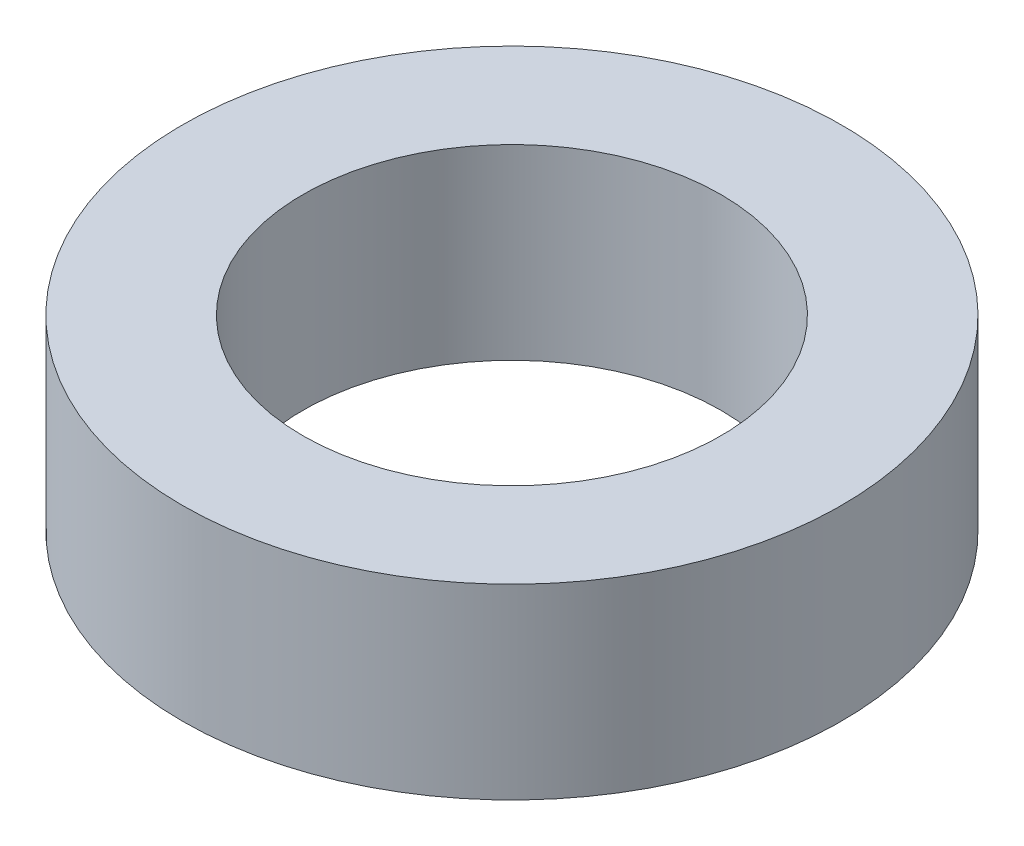
ISO-10303-21;
HEADER;
FILE_DESCRIPTION(('STEP AP214'),'2;1');
FILE_NAME('part.step','',(''),(''),'','','');
FILE_SCHEMA(('AUTOMOTIVE_DESIGN { 1 0 10303 214 1 1 1 1 }'));
ENDSEC;
DATA;
#1=APPLICATION_CONTEXT('core data for automotive mechanical design processes');
#2=APPLICATION_PROTOCOL_DEFINITION('international standard','automotive_design',2000,#1);
#3=PRODUCT_CONTEXT('',#1,'mechanical');
#4=PRODUCT('Part','Part','',(#3));
#5=PRODUCT_RELATED_PRODUCT_CATEGORY('part','',(#4));
#6=PRODUCT_DEFINITION_FORMATION('','',#4);
#7=PRODUCT_DEFINITION_CONTEXT('part definition',#1,'design');
#8=PRODUCT_DEFINITION('design','',#6,#7);
#9=PRODUCT_DEFINITION_SHAPE('','',#8);
#10=(LENGTH_UNIT() NAMED_UNIT(*) SI_UNIT(.MILLI.,.METRE.));
#11=(NAMED_UNIT(*) PLANE_ANGLE_UNIT() SI_UNIT($,.RADIAN.));
#12=(NAMED_UNIT(*) SI_UNIT($,.STERADIAN.) SOLID_ANGLE_UNIT());
#13=UNCERTAINTY_MEASURE_WITH_UNIT(LENGTH_MEASURE(1.E-05),#10,'distance_accuracy_value','');
#14=(GEOMETRIC_REPRESENTATION_CONTEXT(3) GLOBAL_UNCERTAINTY_ASSIGNED_CONTEXT((#13)) GLOBAL_UNIT_ASSIGNED_CONTEXT((#10,
#11,#12)) REPRESENTATION_CONTEXT('',''));
#15=CARTESIAN_POINT('',(0.,0.,0.));
#16=DIRECTION('',(0.,0.,1.));
#17=DIRECTION('',(1.,0.,0.));
#18=AXIS2_PLACEMENT_3D('',#15,#16,#17);
#19=CARTESIAN_POINT('',(-88.9,16.,0.));
#20=DIRECTION('',(0.,-1.,0.));
#21=DIRECTION('',(0.,0.,-1.));
#22=AXIS2_PLACEMENT_3D('',#19,#20,#21);
#23=PLANE('',#22);
#24=CARTESIAN_POINT('',(-88.9,16.,0.));
#25=DIRECTION('',(0.,-1.,0.));
#26=DIRECTION('',(0.,0.,-1.));
#27=AXIS2_PLACEMENT_3D('',#24,#25,#26);
#28=CIRCLE('',#27,8.20000000000002);
#29=CARTESIAN_POINT('',(-88.9,16.,8.20000000000005));
#30=VERTEX_POINT('',#29);
#31=EDGE_CURVE('E46',#30,#30,#28,.T.);
#32=ORIENTED_EDGE('',*,*,#31,.F.);
#33=EDGE_LOOP('',(#32));
#34=FACE_BOUND('',#33,.T.);
#35=CARTESIAN_POINT('',(-88.9,16.,0.));
#36=DIRECTION('',(0.,-1.,0.));
#37=DIRECTION('',(0.,0.,-1.));
#38=AXIS2_PLACEMENT_3D('',#35,#36,#37);
#39=CIRCLE('',#38,5.20000000000001);
#40=CARTESIAN_POINT('',(-88.9,16.,5.20000000000004));
#41=VERTEX_POINT('',#40);
#42=EDGE_CURVE('E55',#41,#41,#39,.T.);
#43=ORIENTED_EDGE('',*,*,#42,.T.);
#44=EDGE_LOOP('',(#43));
#45=FACE_BOUND('',#44,.T.);
#46=ADVANCED_FACE('F39',(#34,#45),#23,.F.);
#47=CARTESIAN_POINT('',(-88.9,-11.8431024229188,0.));
#48=DIRECTION('',(0.,1.,0.));
#49=DIRECTION('',(0.,0.,1.));
#50=AXIS2_PLACEMENT_3D('',#47,#48,#49);
#51=CYLINDRICAL_SURFACE('',#50,8.20000000000002);
#52=CARTESIAN_POINT('',(-88.9,11.35,0.));
#53=DIRECTION('',(0.,1.,0.));
#54=DIRECTION('',(0.,0.,1.));
#55=AXIS2_PLACEMENT_3D('',#52,#53,#54);
#56=CIRCLE('',#55,8.20000000000002);
#57=CARTESIAN_POINT('',(-88.9,11.35,8.20000000000005));
#58=VERTEX_POINT('',#57);
#59=EDGE_CURVE('E50',#58,#58,#56,.T.);
#60=CARTESIAN_POINT('',(-88.9,11.35,8.20000000000005));
#61=CARTESIAN_POINT('',(-88.9,11.3984375,8.20000000000005));
#62=CARTESIAN_POINT('',(-88.9,11.446875,8.20000000000005));
#63=CARTESIAN_POINT('',(-88.9,11.54375,8.20000000000005));
#64=CARTESIAN_POINT('',(-88.9,11.5921875,8.20000000000005));
#65=CARTESIAN_POINT('',(-88.9,11.6890625,8.20000000000005));
#66=CARTESIAN_POINT('',(-88.9,11.7375,8.20000000000005));
#67=CARTESIAN_POINT('',(-88.9,11.834375,8.20000000000005));
#68=CARTESIAN_POINT('',(-88.9,11.8828125,8.20000000000005));
#69=CARTESIAN_POINT('',(-88.9,11.9796875,8.20000000000005));
#70=CARTESIAN_POINT('',(-88.9,12.028125,8.20000000000005));
#71=CARTESIAN_POINT('',(-88.9,12.125,8.20000000000005));
#72=CARTESIAN_POINT('',(-88.9,12.1734375,8.20000000000005));
#73=CARTESIAN_POINT('',(-88.9,12.2703125,8.20000000000005));
#74=CARTESIAN_POINT('',(-88.9,12.31875,8.20000000000005));
#75=CARTESIAN_POINT('',(-88.9,12.415625,8.20000000000005));
#76=CARTESIAN_POINT('',(-88.9,12.4640625,8.20000000000005));
#77=CARTESIAN_POINT('',(-88.9,12.5609375,8.20000000000005));
#78=CARTESIAN_POINT('',(-88.9,12.609375,8.20000000000005));
#79=CARTESIAN_POINT('',(-88.9,12.70625,8.20000000000005));
#80=CARTESIAN_POINT('',(-88.9,12.7546875,8.20000000000005));
#81=CARTESIAN_POINT('',(-88.9,12.8515625,8.20000000000005));
#82=CARTESIAN_POINT('',(-88.9,12.9,8.20000000000005));
#83=CARTESIAN_POINT('',(-88.9,12.996875,8.20000000000005));
#84=CARTESIAN_POINT('',(-88.9,13.0453125,8.20000000000005));
#85=CARTESIAN_POINT('',(-88.9,13.1421875,8.20000000000005));
#86=CARTESIAN_POINT('',(-88.9,13.190625,8.20000000000005));
#87=CARTESIAN_POINT('',(-88.9,13.2875,8.20000000000005));
#88=CARTESIAN_POINT('',(-88.9,13.3359375,8.20000000000005));
#89=CARTESIAN_POINT('',(-88.9,13.4328125,8.20000000000005));
#90=CARTESIAN_POINT('',(-88.9,13.48125,8.20000000000005));
#91=CARTESIAN_POINT('',(-88.9,13.578125,8.20000000000005));
#92=CARTESIAN_POINT('',(-88.9,13.6265625,8.20000000000005));
#93=CARTESIAN_POINT('',(-88.9,13.7234375,8.20000000000005));
#94=CARTESIAN_POINT('',(-88.9,13.771875,8.20000000000005));
#95=CARTESIAN_POINT('',(-88.9,13.86875,8.20000000000005));
#96=CARTESIAN_POINT('',(-88.9,13.9171875,8.20000000000005));
#97=CARTESIAN_POINT('',(-88.9,14.0140625,8.20000000000005));
#98=CARTESIAN_POINT('',(-88.9,14.0625,8.20000000000005));
#99=CARTESIAN_POINT('',(-88.9,14.159375,8.20000000000005));
#100=CARTESIAN_POINT('',(-88.9,14.2078125,8.20000000000005));
#101=CARTESIAN_POINT('',(-88.9,14.3046875,8.20000000000005));
#102=CARTESIAN_POINT('',(-88.9,14.353125,8.20000000000005));
#103=CARTESIAN_POINT('',(-88.9,14.45,8.20000000000005));
#104=CARTESIAN_POINT('',(-88.9,14.4984375,8.20000000000005));
#105=CARTESIAN_POINT('',(-88.9,14.5953125,8.20000000000005));
#106=CARTESIAN_POINT('',(-88.9,14.64375,8.20000000000005));
#107=CARTESIAN_POINT('',(-88.9,14.740625,8.20000000000005));
#108=CARTESIAN_POINT('',(-88.9,14.7890625,8.20000000000005));
#109=CARTESIAN_POINT('',(-88.9,14.8859375,8.20000000000005));
#110=CARTESIAN_POINT('',(-88.9,14.934375,8.20000000000005));
#111=CARTESIAN_POINT('',(-88.9,15.03125,8.20000000000005));
#112=CARTESIAN_POINT('',(-88.9,15.0796875,8.20000000000005));
#113=CARTESIAN_POINT('',(-88.9,15.1765625,8.20000000000005));
#114=CARTESIAN_POINT('',(-88.9,15.225,8.20000000000005));
#115=CARTESIAN_POINT('',(-88.9,15.321875,8.20000000000005));
#116=CARTESIAN_POINT('',(-88.9,15.3703125,8.20000000000005));
#117=CARTESIAN_POINT('',(-88.9,15.4671875,8.20000000000005));
#118=CARTESIAN_POINT('',(-88.9,15.515625,8.20000000000005));
#119=CARTESIAN_POINT('',(-88.9,15.6125,8.20000000000005));
#120=CARTESIAN_POINT('',(-88.9,15.6609375,8.20000000000005));
#121=CARTESIAN_POINT('',(-88.9,15.7578125,8.20000000000005));
#122=CARTESIAN_POINT('',(-88.9,15.80625,8.20000000000005));
#123=CARTESIAN_POINT('',(-88.9,15.903125,8.20000000000005));
#124=CARTESIAN_POINT('',(-88.9,15.9515625,8.20000000000005));
#125=CARTESIAN_POINT('',(-88.9,16.,8.20000000000005));
#126=B_SPLINE_CURVE_WITH_KNOTS('',3,(#60,#61,#62,#63,#64,#65,#66,#67,#68,#69,#70,#71,#72,#73,
#74,#75,#76,#77,#78,#79,#80,#81,#82,#83,#84,#85,#86,#87,#88,#89,#90,#91,#92,#93,#94,#95,#96,#97,
#98,#99,#100,#101,#102,#103,#104,#105,#106,#107,#108,#109,#110,#111,#112,#113,#114,#115,#116,
#117,#118,#119,#120,#121,#122,#123,#124,#125),.UNSPECIFIED.,.F.,.F.,(4,2,2,2,2,2,2,2,2,2,2,2,2,
2,2,2,2,2,2,2,2,2,2,2,2,2,2,2,2,2,2,2,4),(0.,0.145312500000001,0.290624999999999,
0.435937500000001,0.581250000000002,0.7265625,0.871875000000001,1.0171875,1.1625,1.3078125,
1.453125,1.5984375,1.74375,1.8890625,2.03437500000001,2.1796875,2.325,2.47031250000001,2.615625,
2.7609375,2.90625000000001,3.05156250000001,3.19687500000001,3.34218750000001,3.4875,
3.63281250000001,3.77812500000001,3.92343750000001,4.06875000000001,4.21406250000001,
4.35937500000001,4.50468750000001,4.65000000000001),.UNSPECIFIED.);
#127=EDGE_CURVE('BSEAM63',#58,#30,#126,.T.);
#128=ORIENTED_EDGE('',*,*,#59,.T.);
#129=ORIENTED_EDGE('',*,*,#31,.T.);
#130=ORIENTED_EDGE('',*,*,#127,.T.);
#131=ORIENTED_EDGE('',*,*,#127,.F.);
#132=EDGE_LOOP('',(#128,#130,#129,#131));
#133=FACE_BOUND('',#132,.T.);
#134=ADVANCED_FACE('F63',(#133),#51,.T.);
#135=CARTESIAN_POINT('',(-88.9,-11.8431024229188,0.));
#136=DIRECTION('',(0.,1.,0.));
#137=DIRECTION('',(0.,0.,1.));
#138=AXIS2_PLACEMENT_3D('',#135,#136,#137);
#139=CYLINDRICAL_SURFACE('',#138,5.20000000000001);
#140=CARTESIAN_POINT('',(-88.9,11.35,0.));
#141=DIRECTION('',(0.,1.,0.));
#142=DIRECTION('',(0.,0.,1.));
#143=AXIS2_PLACEMENT_3D('',#140,#141,#142);
#144=CIRCLE('',#143,5.20000000000001);
#145=CARTESIAN_POINT('',(-88.9,11.35,5.20000000000004));
#146=VERTEX_POINT('',#145);
#147=EDGE_CURVE('E10',#146,#146,#144,.T.);
#148=CARTESIAN_POINT('',(-88.9,11.35,5.20000000000004));
#149=CARTESIAN_POINT('',(-88.9,11.3984375,5.20000000000004));
#150=CARTESIAN_POINT('',(-88.9,11.446875,5.20000000000004));
#151=CARTESIAN_POINT('',(-88.9,11.54375,5.20000000000004));
#152=CARTESIAN_POINT('',(-88.9,11.5921875,5.20000000000004));
#153=CARTESIAN_POINT('',(-88.9,11.6890625,5.20000000000004));
#154=CARTESIAN_POINT('',(-88.9,11.7375,5.20000000000004));
#155=CARTESIAN_POINT('',(-88.9,11.834375,5.20000000000004));
#156=CARTESIAN_POINT('',(-88.9,11.8828125,5.20000000000004));
#157=CARTESIAN_POINT('',(-88.9,11.9796875,5.20000000000004));
#158=CARTESIAN_POINT('',(-88.9,12.028125,5.20000000000004));
#159=CARTESIAN_POINT('',(-88.9,12.125,5.20000000000004));
#160=CARTESIAN_POINT('',(-88.9,12.1734375,5.20000000000004));
#161=CARTESIAN_POINT('',(-88.9,12.2703125,5.20000000000004));
#162=CARTESIAN_POINT('',(-88.9,12.31875,5.20000000000004));
#163=CARTESIAN_POINT('',(-88.9,12.415625,5.20000000000004));
#164=CARTESIAN_POINT('',(-88.9,12.4640625,5.20000000000004));
#165=CARTESIAN_POINT('',(-88.9,12.5609375,5.20000000000004));
#166=CARTESIAN_POINT('',(-88.9,12.609375,5.20000000000004));
#167=CARTESIAN_POINT('',(-88.9,12.70625,5.20000000000004));
#168=CARTESIAN_POINT('',(-88.9,12.7546875,5.20000000000004));
#169=CARTESIAN_POINT('',(-88.9,12.8515625,5.20000000000004));
#170=CARTESIAN_POINT('',(-88.9,12.9,5.20000000000004));
#171=CARTESIAN_POINT('',(-88.9,12.996875,5.20000000000004));
#172=CARTESIAN_POINT('',(-88.9,13.0453125,5.20000000000004));
#173=CARTESIAN_POINT('',(-88.9,13.1421875,5.20000000000004));
#174=CARTESIAN_POINT('',(-88.9,13.190625,5.20000000000004));
#175=CARTESIAN_POINT('',(-88.9,13.2875,5.20000000000004));
#176=CARTESIAN_POINT('',(-88.9,13.3359375,5.20000000000004));
#177=CARTESIAN_POINT('',(-88.9,13.4328125,5.20000000000004));
#178=CARTESIAN_POINT('',(-88.9,13.48125,5.20000000000004));
#179=CARTESIAN_POINT('',(-88.9,13.578125,5.20000000000004));
#180=CARTESIAN_POINT('',(-88.9,13.6265625,5.20000000000004));
#181=CARTESIAN_POINT('',(-88.9,13.7234375,5.20000000000004));
#182=CARTESIAN_POINT('',(-88.9,13.771875,5.20000000000004));
#183=CARTESIAN_POINT('',(-88.9,13.86875,5.20000000000004));
#184=CARTESIAN_POINT('',(-88.9,13.9171875,5.20000000000004));
#185=CARTESIAN_POINT('',(-88.9,14.0140625,5.20000000000004));
#186=CARTESIAN_POINT('',(-88.9,14.0625,5.20000000000004));
#187=CARTESIAN_POINT('',(-88.9,14.159375,5.20000000000004));
#188=CARTESIAN_POINT('',(-88.9,14.2078125,5.20000000000004));
#189=CARTESIAN_POINT('',(-88.9,14.3046875,5.20000000000004));
#190=CARTESIAN_POINT('',(-88.9,14.353125,5.20000000000004));
#191=CARTESIAN_POINT('',(-88.9,14.45,5.20000000000004));
#192=CARTESIAN_POINT('',(-88.9,14.4984375,5.20000000000004));
#193=CARTESIAN_POINT('',(-88.9,14.5953125,5.20000000000004));
#194=CARTESIAN_POINT('',(-88.9,14.64375,5.20000000000004));
#195=CARTESIAN_POINT('',(-88.9,14.740625,5.20000000000004));
#196=CARTESIAN_POINT('',(-88.9,14.7890625,5.20000000000004));
#197=CARTESIAN_POINT('',(-88.9,14.8859375,5.20000000000004));
#198=CARTESIAN_POINT('',(-88.9,14.934375,5.20000000000004));
#199=CARTESIAN_POINT('',(-88.9,15.03125,5.20000000000004));
#200=CARTESIAN_POINT('',(-88.9,15.0796875,5.20000000000004));
#201=CARTESIAN_POINT('',(-88.9,15.1765625,5.20000000000004));
#202=CARTESIAN_POINT('',(-88.9,15.225,5.20000000000004));
#203=CARTESIAN_POINT('',(-88.9,15.321875,5.20000000000004));
#204=CARTESIAN_POINT('',(-88.9,15.3703125,5.20000000000004));
#205=CARTESIAN_POINT('',(-88.9,15.4671875,5.20000000000004));
#206=CARTESIAN_POINT('',(-88.9,15.515625,5.20000000000004));
#207=CARTESIAN_POINT('',(-88.9,15.6125,5.20000000000004));
#208=CARTESIAN_POINT('',(-88.9,15.6609375,5.20000000000004));
#209=CARTESIAN_POINT('',(-88.9,15.7578125,5.20000000000004));
#210=CARTESIAN_POINT('',(-88.9,15.80625,5.20000000000004));
#211=CARTESIAN_POINT('',(-88.9,15.903125,5.20000000000004));
#212=CARTESIAN_POINT('',(-88.9,15.9515625,5.20000000000004));
#213=CARTESIAN_POINT('',(-88.9,16.,5.20000000000004));
#214=B_SPLINE_CURVE_WITH_KNOTS('',3,(#148,#149,#150,#151,#152,#153,#154,#155,#156,#157,#158,
#159,#160,#161,#162,#163,#164,#165,#166,#167,#168,#169,#170,#171,#172,#173,#174,#175,#176,#177,
#178,#179,#180,#181,#182,#183,#184,#185,#186,#187,#188,#189,#190,#191,#192,#193,#194,#195,#196,
#197,#198,#199,#200,#201,#202,#203,#204,#205,#206,#207,#208,#209,#210,#211,#212,#213),
.UNSPECIFIED.,.F.,.F.,(4,2,2,2,2,2,2,2,2,2,2,2,2,2,2,2,2,2,2,2,2,2,2,2,2,2,2,2,2,2,2,2,4),(0.,
0.145312500000001,0.290624999999999,0.435937500000001,0.581250000000002,0.7265625,
0.871875000000001,1.0171875,1.1625,1.3078125,1.453125,1.5984375,1.74375,1.8890625,
2.03437500000001,2.1796875,2.325,2.47031250000001,2.615625,2.7609375,2.90625000000001,
3.05156250000001,3.19687500000001,3.34218750000001,3.4875,3.63281250000001,3.77812500000001,
3.92343750000001,4.06875000000001,4.21406250000001,4.35937500000001,4.50468750000001,
4.65000000000001),.UNSPECIFIED.);
#215=EDGE_CURVE('BSEAM61',#146,#41,#214,.T.);
#216=ORIENTED_EDGE('',*,*,#147,.F.);
#217=ORIENTED_EDGE('',*,*,#42,.F.);
#218=ORIENTED_EDGE('',*,*,#215,.T.);
#219=ORIENTED_EDGE('',*,*,#215,.F.);
#220=EDGE_LOOP('',(#216,#218,#217,#219));
#221=FACE_BOUND('',#220,.T.);
#222=ADVANCED_FACE('F61',(#221),#139,.F.);
#223=CARTESIAN_POINT('',(0.,11.35,0.));
#224=DIRECTION('',(0.,1.,0.));
#225=DIRECTION('',(0.,0.,1.));
#226=AXIS2_PLACEMENT_3D('',#223,#224,#225);
#227=PLANE('',#226);
#228=ORIENTED_EDGE('',*,*,#147,.T.);
#229=EDGE_LOOP('',(#228));
#230=FACE_BOUND('',#229,.T.);
#231=ORIENTED_EDGE('',*,*,#59,.F.);
#232=EDGE_LOOP('',(#231));
#233=FACE_BOUND('',#232,.T.);
#234=ADVANCED_FACE('F41',(#230,#233),#227,.F.);
#235=CLOSED_SHELL('',(#46,#134,#222,#234));
#236=MANIFOLD_SOLID_BREP('B2',#235);
#237=ADVANCED_BREP_SHAPE_REPRESENTATION('',(#18,#236),#14);
#238=SHAPE_DEFINITION_REPRESENTATION(#9,#237);
ENDSEC;
END-ISO-10303-21;
